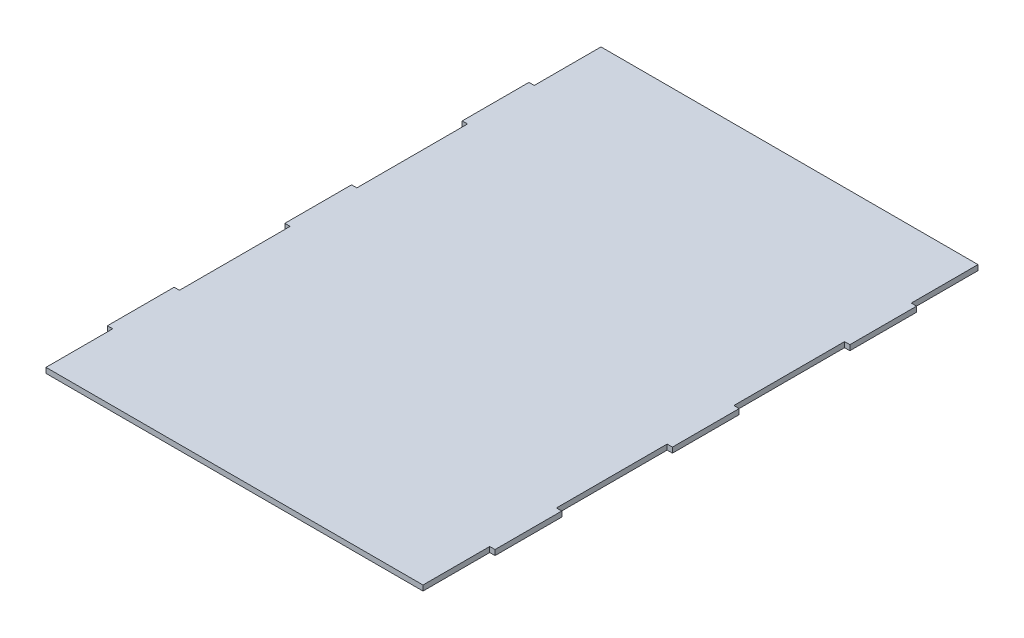
ISO-10303-21;
HEADER;
FILE_DESCRIPTION(('STEP AP214'),'2;1');
FILE_NAME('part.step','',(''),(''),'','','');
FILE_SCHEMA(('AUTOMOTIVE_DESIGN { 1 0 10303 214 1 1 1 1 }'));
ENDSEC;
DATA;
#1=APPLICATION_CONTEXT('core data for automotive mechanical design processes');
#2=APPLICATION_PROTOCOL_DEFINITION('international standard','automotive_design',2000,#1);
#3=PRODUCT_CONTEXT('',#1,'mechanical');
#4=PRODUCT('Part','Part','',(#3));
#5=PRODUCT_RELATED_PRODUCT_CATEGORY('part','',(#4));
#6=PRODUCT_DEFINITION_FORMATION('','',#4);
#7=PRODUCT_DEFINITION_CONTEXT('part definition',#1,'design');
#8=PRODUCT_DEFINITION('design','',#6,#7);
#9=PRODUCT_DEFINITION_SHAPE('','',#8);
#10=(LENGTH_UNIT() NAMED_UNIT(*) SI_UNIT(.MILLI.,.METRE.));
#11=(NAMED_UNIT(*) PLANE_ANGLE_UNIT() SI_UNIT($,.RADIAN.));
#12=(NAMED_UNIT(*) SI_UNIT($,.STERADIAN.) SOLID_ANGLE_UNIT());
#13=UNCERTAINTY_MEASURE_WITH_UNIT(LENGTH_MEASURE(1.E-05),#10,'distance_accuracy_value','');
#14=(GEOMETRIC_REPRESENTATION_CONTEXT(3) GLOBAL_UNCERTAINTY_ASSIGNED_CONTEXT((#13)) GLOBAL_UNIT_ASSIGNED_CONTEXT((#10,
#11,#12)) REPRESENTATION_CONTEXT('',''));
#15=CARTESIAN_POINT('',(0.,0.,0.));
#16=DIRECTION('',(0.,0.,1.));
#17=DIRECTION('',(1.,0.,0.));
#18=AXIS2_PLACEMENT_3D('',#15,#16,#17);
#19=CARTESIAN_POINT('',(226.,3.175,0.));
#20=DIRECTION('',(-1.,0.,0.));
#21=DIRECTION('',(0.,0.,1.));
#22=AXIS2_PLACEMENT_3D('',#19,#20,#21);
#23=PLANE('',#22);
#24=DIRECTION('',(0.,0.,-1.));
#25=VECTOR('',#24,1.);
#26=CARTESIAN_POINT('',(226.,3.175,0.));
#27=LINE('',#26,#25);
#28=CARTESIAN_POINT('',(226.,3.175,252.7));
#29=VERTEX_POINT('',#28);
#30=CARTESIAN_POINT('',(226.,3.175,186.35));
#31=VERTEX_POINT('',#30);
#32=EDGE_CURVE('E37',#29,#31,#27,.T.);
#33=ORIENTED_EDGE('',*,*,#32,.F.);
#34=DIRECTION('',(0.,1.,0.));
#35=VECTOR('',#34,1.);
#36=CARTESIAN_POINT('',(226.,-40.1258099606725,252.7));
#37=LINE('',#36,#35);
#38=CARTESIAN_POINT('',(226.,0.,252.7));
#39=VERTEX_POINT('',#38);
#40=EDGE_CURVE('E252',#39,#29,#37,.T.);
#41=ORIENTED_EDGE('',*,*,#40,.F.);
#42=DIRECTION('',(0.,0.,-1.));
#43=VECTOR('',#42,1.);
#44=CARTESIAN_POINT('',(226.,0.,0.));
#45=LINE('',#44,#43);
#46=CARTESIAN_POINT('',(226.,0.,186.35));
#47=VERTEX_POINT('',#46);
#48=EDGE_CURVE('E431',#39,#47,#45,.T.);
#49=ORIENTED_EDGE('',*,*,#48,.T.);
#50=DIRECTION('',(0.,1.,0.));
#51=VECTOR('',#50,1.);
#52=CARTESIAN_POINT('',(226.,-40.1258099606725,186.35));
#53=LINE('',#52,#51);
#54=EDGE_CURVE('E298',#47,#31,#53,.T.);
#55=ORIENTED_EDGE('',*,*,#54,.T.);
#56=EDGE_LOOP('',(#33,#41,#49,#55));
#57=FACE_BOUND('',#56,.T.);
#58=ADVANCED_FACE('F33',(#57),#23,.F.);
#59=CARTESIAN_POINT('',(0.,3.175,0.));
#60=DIRECTION('',(1.,0.,0.));
#61=DIRECTION('',(0.,0.,-1.));
#62=AXIS2_PLACEMENT_3D('',#59,#60,#61);
#63=PLANE('',#62);
#64=DIRECTION('',(0.,0.,1.));
#65=VECTOR('',#64,1.);
#66=CARTESIAN_POINT('',(0.,3.175,0.));
#67=LINE('',#66,#65);
#68=CARTESIAN_POINT('',(0.,3.175,292.7));
#69=VERTEX_POINT('',#68);
#70=CARTESIAN_POINT('',(0.,3.175,332.7));
#71=VERTEX_POINT('',#70);
#72=EDGE_CURVE('E425',#69,#71,#67,.T.);
#73=ORIENTED_EDGE('',*,*,#72,.F.);
#74=DIRECTION('',(0.,1.,0.));
#75=VECTOR('',#74,1.);
#76=CARTESIAN_POINT('',(0.,-40.1258099606725,292.7));
#77=LINE('',#76,#75);
#78=CARTESIAN_POINT('',(0.,0.,292.7));
#79=VERTEX_POINT('',#78);
#80=EDGE_CURVE('E262',#79,#69,#77,.T.);
#81=ORIENTED_EDGE('',*,*,#80,.F.);
#82=DIRECTION('',(0.,0.,1.));
#83=VECTOR('',#82,1.);
#84=CARTESIAN_POINT('',(0.,0.,0.));
#85=LINE('',#84,#83);
#86=CARTESIAN_POINT('',(0.,0.,332.7));
#87=VERTEX_POINT('',#86);
#88=EDGE_CURVE('E403',#79,#87,#85,.T.);
#89=ORIENTED_EDGE('',*,*,#88,.T.);
#90=DIRECTION('',(0.,-1.,0.));
#91=VECTOR('',#90,1.);
#92=CARTESIAN_POINT('',(0.,3.175,332.7));
#93=LINE('',#92,#91);
#94=EDGE_CURVE('E11',#71,#87,#93,.T.);
#95=ORIENTED_EDGE('',*,*,#94,.F.);
#96=EDGE_LOOP('',(#73,#81,#89,#95));
#97=FACE_BOUND('',#96,.T.);
#98=ADVANCED_FACE('F518',(#97),#63,.F.);
#99=CARTESIAN_POINT('',(226.,3.175,146.35));
#100=VERTEX_POINT('',#99);
#101=CARTESIAN_POINT('',(226.,3.175,80.));
#102=VERTEX_POINT('',#101);
#103=EDGE_CURVE('E433',#100,#102,#27,.T.);
#104=ORIENTED_EDGE('',*,*,#103,.F.);
#105=DIRECTION('',(0.,1.,0.));
#106=VECTOR('',#105,1.);
#107=CARTESIAN_POINT('',(226.,-40.1258099606725,146.35));
#108=LINE('',#107,#106);
#109=CARTESIAN_POINT('',(226.,0.,146.35));
#110=VERTEX_POINT('',#109);
#111=EDGE_CURVE('E287',#110,#100,#108,.T.);
#112=ORIENTED_EDGE('',*,*,#111,.F.);
#113=CARTESIAN_POINT('',(226.,0.,80.));
#114=VERTEX_POINT('',#113);
#115=EDGE_CURVE('E428',#110,#114,#45,.T.);
#116=ORIENTED_EDGE('',*,*,#115,.T.);
#117=DIRECTION('',(0.,1.,0.));
#118=VECTOR('',#117,1.);
#119=CARTESIAN_POINT('',(226.,-40.1258099606725,80.));
#120=LINE('',#119,#118);
#121=EDGE_CURVE('E354',#114,#102,#120,.T.);
#122=ORIENTED_EDGE('',*,*,#121,.T.);
#123=EDGE_LOOP('',(#104,#112,#116,#122));
#124=FACE_BOUND('',#123,.T.);
#125=ADVANCED_FACE('F535',(#124),#23,.F.);
#126=CARTESIAN_POINT('',(0.,0.,186.35));
#127=VERTEX_POINT('',#126);
#128=CARTESIAN_POINT('',(0.,0.,252.7));
#129=VERTEX_POINT('',#128);
#130=EDGE_CURVE('E426',#127,#129,#85,.T.);
#131=ORIENTED_EDGE('',*,*,#130,.T.);
#132=DIRECTION('',(0.,1.,0.));
#133=VECTOR('',#132,1.);
#134=CARTESIAN_POINT('',(0.,-40.1258099606725,252.7));
#135=LINE('',#134,#133);
#136=CARTESIAN_POINT('',(0.,3.175,252.7));
#137=VERTEX_POINT('',#136);
#138=EDGE_CURVE('E273',#129,#137,#135,.T.);
#139=ORIENTED_EDGE('',*,*,#138,.T.);
#140=CARTESIAN_POINT('',(0.,3.175,186.35));
#141=VERTEX_POINT('',#140);
#142=EDGE_CURVE('E421',#141,#137,#67,.T.);
#143=ORIENTED_EDGE('',*,*,#142,.F.);
#144=DIRECTION('',(0.,1.,0.));
#145=VECTOR('',#144,1.);
#146=CARTESIAN_POINT('',(0.,-40.1258099606725,186.35));
#147=LINE('',#146,#145);
#148=EDGE_CURVE('E312',#127,#141,#147,.T.);
#149=ORIENTED_EDGE('',*,*,#148,.F.);
#150=EDGE_LOOP('',(#131,#139,#143,#149));
#151=FACE_BOUND('',#150,.T.);
#152=ADVANCED_FACE('F500',(#151),#63,.F.);
#153=DIRECTION('',(0.,1.,0.));
#154=VECTOR('',#153,1.);
#155=CARTESIAN_POINT('',(226.,-40.1258099606725,40.));
#156=LINE('',#155,#154);
#157=CARTESIAN_POINT('',(226.,0.,40.));
#158=VERTEX_POINT('',#157);
#159=CARTESIAN_POINT('',(226.,3.175,40.));
#160=VERTEX_POINT('',#159);
#161=EDGE_CURVE('E337',#158,#160,#156,.T.);
#162=ORIENTED_EDGE('',*,*,#161,.F.);
#163=CARTESIAN_POINT('',(226.,0.,0.));
#164=VERTEX_POINT('',#163);
#165=EDGE_CURVE('E432',#158,#164,#45,.T.);
#166=ORIENTED_EDGE('',*,*,#165,.T.);
#167=DIRECTION('',(0.,-1.,0.));
#168=VECTOR('',#167,1.);
#169=CARTESIAN_POINT('',(226.,3.175,0.));
#170=LINE('',#169,#168);
#171=CARTESIAN_POINT('',(226.,3.175,0.));
#172=VERTEX_POINT('',#171);
#173=EDGE_CURVE('E461',#172,#164,#170,.T.);
#174=ORIENTED_EDGE('',*,*,#173,.F.);
#175=EDGE_CURVE('E350',#160,#172,#27,.T.);
#176=ORIENTED_EDGE('',*,*,#175,.F.);
#177=EDGE_LOOP('',(#162,#166,#174,#176));
#178=FACE_BOUND('',#177,.T.);
#179=ADVANCED_FACE('F527',(#178),#23,.F.);
#180=CARTESIAN_POINT('',(0.,0.,80.));
#181=VERTEX_POINT('',#180);
#182=CARTESIAN_POINT('',(0.,0.,146.35));
#183=VERTEX_POINT('',#182);
#184=EDGE_CURVE('E455',#181,#183,#85,.T.);
#185=ORIENTED_EDGE('',*,*,#184,.T.);
#186=DIRECTION('',(0.,1.,0.));
#187=VECTOR('',#186,1.);
#188=CARTESIAN_POINT('',(0.,-40.1258099606725,146.35));
#189=LINE('',#188,#187);
#190=CARTESIAN_POINT('',(0.,3.175,146.35));
#191=VERTEX_POINT('',#190);
#192=EDGE_CURVE('E323',#183,#191,#189,.T.);
#193=ORIENTED_EDGE('',*,*,#192,.T.);
#194=CARTESIAN_POINT('',(0.,3.175,80.));
#195=VERTEX_POINT('',#194);
#196=EDGE_CURVE('E389',#195,#191,#67,.T.);
#197=ORIENTED_EDGE('',*,*,#196,.F.);
#198=DIRECTION('',(0.,1.,0.));
#199=VECTOR('',#198,1.);
#200=CARTESIAN_POINT('',(0.,-40.1258099606725,80.));
#201=LINE('',#200,#199);
#202=EDGE_CURVE('E376',#181,#195,#201,.T.);
#203=ORIENTED_EDGE('',*,*,#202,.F.);
#204=EDGE_LOOP('',(#185,#193,#197,#203));
#205=FACE_BOUND('',#204,.T.);
#206=ADVANCED_FACE('F537',(#205),#63,.F.);
#207=CARTESIAN_POINT('',(0.,0.,0.));
#208=VERTEX_POINT('',#207);
#209=CARTESIAN_POINT('',(0.,0.,40.));
#210=VERTEX_POINT('',#209);
#211=EDGE_CURVE('E458',#208,#210,#85,.T.);
#212=ORIENTED_EDGE('',*,*,#211,.T.);
#213=DIRECTION('',(0.,1.,0.));
#214=VECTOR('',#213,1.);
#215=CARTESIAN_POINT('',(0.,-40.1258099606725,40.));
#216=LINE('',#215,#214);
#217=CARTESIAN_POINT('',(0.,3.175,40.));
#218=VERTEX_POINT('',#217);
#219=EDGE_CURVE('E394',#210,#218,#216,.T.);
#220=ORIENTED_EDGE('',*,*,#219,.T.);
#221=CARTESIAN_POINT('',(0.,3.175,0.));
#222=VERTEX_POINT('',#221);
#223=EDGE_CURVE('E418',#222,#218,#67,.T.);
#224=ORIENTED_EDGE('',*,*,#223,.F.);
#225=DIRECTION('',(0.,-1.,0.));
#226=VECTOR('',#225,1.);
#227=CARTESIAN_POINT('',(0.,3.175,0.));
#228=LINE('',#227,#226);
#229=EDGE_CURVE('E463',#222,#208,#228,.T.);
#230=ORIENTED_EDGE('',*,*,#229,.T.);
#231=EDGE_LOOP('',(#212,#220,#224,#230));
#232=FACE_BOUND('',#231,.T.);
#233=ADVANCED_FACE('F35',(#232),#63,.F.);
#234=CARTESIAN_POINT('',(0.,3.175,332.7));
#235=DIRECTION('',(0.,0.,-1.));
#236=DIRECTION('',(-1.,0.,0.));
#237=AXIS2_PLACEMENT_3D('',#234,#235,#236);
#238=PLANE('',#237);
#239=DIRECTION('',(1.,0.,0.));
#240=VECTOR('',#239,1.);
#241=CARTESIAN_POINT('',(0.,0.,332.7));
#242=LINE('',#241,#240);
#243=CARTESIAN_POINT('',(226.,0.,332.7));
#244=VERTEX_POINT('',#243);
#245=EDGE_CURVE('E438',#87,#244,#242,.T.);
#246=ORIENTED_EDGE('',*,*,#245,.T.);
#247=DIRECTION('',(0.,-1.,0.));
#248=VECTOR('',#247,1.);
#249=CARTESIAN_POINT('',(226.,3.175,332.7));
#250=LINE('',#249,#248);
#251=CARTESIAN_POINT('',(226.,3.175,332.7));
#252=VERTEX_POINT('',#251);
#253=EDGE_CURVE('E43',#252,#244,#250,.T.);
#254=ORIENTED_EDGE('',*,*,#253,.F.);
#255=DIRECTION('',(1.,0.,0.));
#256=VECTOR('',#255,1.);
#257=CARTESIAN_POINT('',(0.,3.175,332.7));
#258=LINE('',#257,#256);
#259=EDGE_CURVE('E413',#71,#252,#258,.T.);
#260=ORIENTED_EDGE('',*,*,#259,.F.);
#261=ORIENTED_EDGE('',*,*,#94,.T.);
#262=EDGE_LOOP('',(#246,#254,#260,#261));
#263=FACE_BOUND('',#262,.T.);
#264=ADVANCED_FACE('F522',(#263),#238,.F.);
#265=CARTESIAN_POINT('',(226.,0.,292.7));
#266=VERTEX_POINT('',#265);
#267=EDGE_CURVE('E446',#244,#266,#45,.T.);
#268=ORIENTED_EDGE('',*,*,#267,.T.);
#269=DIRECTION('',(0.,1.,0.));
#270=VECTOR('',#269,1.);
#271=CARTESIAN_POINT('',(226.,-40.1258099606725,292.7));
#272=LINE('',#271,#270);
#273=CARTESIAN_POINT('',(226.,3.175,292.7));
#274=VERTEX_POINT('',#273);
#275=EDGE_CURVE('E58',#266,#274,#272,.T.);
#276=ORIENTED_EDGE('',*,*,#275,.T.);
#277=EDGE_CURVE('E245',#252,#274,#27,.T.);
#278=ORIENTED_EDGE('',*,*,#277,.F.);
#279=ORIENTED_EDGE('',*,*,#253,.T.);
#280=EDGE_LOOP('',(#268,#276,#278,#279));
#281=FACE_BOUND('',#280,.T.);
#282=ADVANCED_FACE('F523',(#281),#23,.F.);
#283=CARTESIAN_POINT('',(0.,3.175,0.));
#284=DIRECTION('',(0.,0.,1.));
#285=DIRECTION('',(1.,0.,0.));
#286=AXIS2_PLACEMENT_3D('',#283,#284,#285);
#287=PLANE('',#286);
#288=DIRECTION('',(-1.,0.,0.));
#289=VECTOR('',#288,1.);
#290=CARTESIAN_POINT('',(0.,0.,0.));
#291=LINE('',#290,#289);
#292=EDGE_CURVE('E439',#164,#208,#291,.T.);
#293=ORIENTED_EDGE('',*,*,#292,.T.);
#294=ORIENTED_EDGE('',*,*,#229,.F.);
#295=DIRECTION('',(-1.,0.,0.));
#296=VECTOR('',#295,1.);
#297=CARTESIAN_POINT('',(0.,3.175,0.));
#298=LINE('',#297,#296);
#299=EDGE_CURVE('E452',#172,#222,#298,.T.);
#300=ORIENTED_EDGE('',*,*,#299,.F.);
#301=ORIENTED_EDGE('',*,*,#173,.T.);
#302=EDGE_LOOP('',(#293,#294,#300,#301));
#303=FACE_BOUND('',#302,.T.);
#304=ADVANCED_FACE('F525',(#303),#287,.F.);
#305=CARTESIAN_POINT('',(0.,3.175,0.));
#306=DIRECTION('',(0.,1.,0.));
#307=DIRECTION('',(0.,0.,1.));
#308=AXIS2_PLACEMENT_3D('',#305,#306,#307);
#309=PLANE('',#308);
#310=ORIENTED_EDGE('',*,*,#223,.T.);
#311=DIRECTION('',(-1.,0.,0.));
#312=VECTOR('',#311,1.);
#313=CARTESIAN_POINT('',(0.,3.175,40.));
#314=LINE('',#313,#312);
#315=CARTESIAN_POINT('',(-3.175,3.175,40.));
#316=VERTEX_POINT('',#315);
#317=EDGE_CURVE('E363',#218,#316,#314,.T.);
#318=ORIENTED_EDGE('',*,*,#317,.T.);
#319=DIRECTION('',(0.,0.,1.));
#320=VECTOR('',#319,1.);
#321=CARTESIAN_POINT('',(-3.175,3.175,40.));
#322=LINE('',#321,#320);
#323=CARTESIAN_POINT('',(-3.17499999999999,3.175,80.));
#324=VERTEX_POINT('',#323);
#325=EDGE_CURVE('E377',#316,#324,#322,.T.);
#326=ORIENTED_EDGE('',*,*,#325,.T.);
#327=DIRECTION('',(1.,0.,0.));
#328=VECTOR('',#327,1.);
#329=CARTESIAN_POINT('',(0.,3.175,80.));
#330=LINE('',#329,#328);
#331=EDGE_CURVE('E380',#324,#195,#330,.T.);
#332=ORIENTED_EDGE('',*,*,#331,.T.);
#333=ORIENTED_EDGE('',*,*,#196,.T.);
#334=DIRECTION('',(-1.,0.,0.));
#335=VECTOR('',#334,1.);
#336=CARTESIAN_POINT('',(0.,3.175,146.35));
#337=LINE('',#336,#335);
#338=CARTESIAN_POINT('',(-3.17499999999998,3.175,146.35));
#339=VERTEX_POINT('',#338);
#340=EDGE_CURVE('E308',#191,#339,#337,.T.);
#341=ORIENTED_EDGE('',*,*,#340,.T.);
#342=DIRECTION('',(0.,0.,1.));
#343=VECTOR('',#342,1.);
#344=CARTESIAN_POINT('',(-3.17499999999998,3.175,146.35));
#345=LINE('',#344,#343);
#346=CARTESIAN_POINT('',(-3.17499999999998,3.175,186.35));
#347=VERTEX_POINT('',#346);
#348=EDGE_CURVE('E317',#339,#347,#345,.T.);
#349=ORIENTED_EDGE('',*,*,#348,.T.);
#350=DIRECTION('',(1.,0.,0.));
#351=VECTOR('',#350,1.);
#352=CARTESIAN_POINT('',(0.,3.175,186.35));
#353=LINE('',#352,#351);
#354=EDGE_CURVE('E320',#347,#141,#353,.T.);
#355=ORIENTED_EDGE('',*,*,#354,.T.);
#356=ORIENTED_EDGE('',*,*,#142,.T.);
#357=DIRECTION('',(-1.,0.,0.));
#358=VECTOR('',#357,1.);
#359=CARTESIAN_POINT('',(0.,3.175,252.7));
#360=LINE('',#359,#358);
#361=CARTESIAN_POINT('',(-3.17499999999997,3.175,252.7));
#362=VERTEX_POINT('',#361);
#363=EDGE_CURVE('E258',#137,#362,#360,.T.);
#364=ORIENTED_EDGE('',*,*,#363,.T.);
#365=DIRECTION('',(0.,0.,1.));
#366=VECTOR('',#365,1.);
#367=CARTESIAN_POINT('',(-3.17499999999997,3.175,252.7));
#368=LINE('',#367,#366);
#369=CARTESIAN_POINT('',(-3.17499999999996,3.175,292.7));
#370=VERTEX_POINT('',#369);
#371=EDGE_CURVE('E267',#362,#370,#368,.T.);
#372=ORIENTED_EDGE('',*,*,#371,.T.);
#373=DIRECTION('',(1.,0.,0.));
#374=VECTOR('',#373,1.);
#375=CARTESIAN_POINT('',(0.,3.175,292.7));
#376=LINE('',#375,#374);
#377=EDGE_CURVE('E270',#370,#69,#376,.T.);
#378=ORIENTED_EDGE('',*,*,#377,.T.);
#379=ORIENTED_EDGE('',*,*,#72,.T.);
#380=ORIENTED_EDGE('',*,*,#259,.T.);
#381=ORIENTED_EDGE('',*,*,#277,.T.);
#382=DIRECTION('',(1.,0.,0.));
#383=VECTOR('',#382,1.);
#384=CARTESIAN_POINT('',(226.,3.175,292.7));
#385=LINE('',#384,#383);
#386=CARTESIAN_POINT('',(229.175,3.175,292.7));
#387=VERTEX_POINT('',#386);
#388=EDGE_CURVE('E227',#274,#387,#385,.T.);
#389=ORIENTED_EDGE('',*,*,#388,.T.);
#390=DIRECTION('',(0.,0.,-1.));
#391=VECTOR('',#390,1.);
#392=CARTESIAN_POINT('',(229.175,3.175,252.7));
#393=LINE('',#392,#391);
#394=CARTESIAN_POINT('',(229.175,3.175,252.7));
#395=VERTEX_POINT('',#394);
#396=EDGE_CURVE('E235',#387,#395,#393,.T.);
#397=ORIENTED_EDGE('',*,*,#396,.T.);
#398=DIRECTION('',(-1.,0.,0.));
#399=VECTOR('',#398,1.);
#400=CARTESIAN_POINT('',(226.,3.175,252.7));
#401=LINE('',#400,#399);
#402=EDGE_CURVE('E241',#395,#29,#401,.T.);
#403=ORIENTED_EDGE('',*,*,#402,.T.);
#404=ORIENTED_EDGE('',*,*,#32,.T.);
#405=DIRECTION('',(1.,0.,0.));
#406=VECTOR('',#405,1.);
#407=CARTESIAN_POINT('',(226.,3.175,186.35));
#408=LINE('',#407,#406);
#409=CARTESIAN_POINT('',(229.175,3.175,186.35));
#410=VERTEX_POINT('',#409);
#411=EDGE_CURVE('E283',#31,#410,#408,.T.);
#412=ORIENTED_EDGE('',*,*,#411,.T.);
#413=DIRECTION('',(0.,0.,-1.));
#414=VECTOR('',#413,1.);
#415=CARTESIAN_POINT('',(229.175,3.175,146.35));
#416=LINE('',#415,#414);
#417=CARTESIAN_POINT('',(229.175,3.175,146.35));
#418=VERTEX_POINT('',#417);
#419=EDGE_CURVE('E292',#410,#418,#416,.T.);
#420=ORIENTED_EDGE('',*,*,#419,.T.);
#421=DIRECTION('',(-1.,0.,0.));
#422=VECTOR('',#421,1.);
#423=CARTESIAN_POINT('',(226.,3.175,146.35));
#424=LINE('',#423,#422);
#425=EDGE_CURVE('E295',#418,#100,#424,.T.);
#426=ORIENTED_EDGE('',*,*,#425,.T.);
#427=ORIENTED_EDGE('',*,*,#103,.T.);
#428=DIRECTION('',(1.,0.,0.));
#429=VECTOR('',#428,1.);
#430=CARTESIAN_POINT('',(226.,3.175,80.));
#431=LINE('',#430,#429);
#432=CARTESIAN_POINT('',(229.175,3.175,80.));
#433=VERTEX_POINT('',#432);
#434=EDGE_CURVE('E333',#102,#433,#431,.T.);
#435=ORIENTED_EDGE('',*,*,#434,.T.);
#436=DIRECTION('',(0.,0.,-1.));
#437=VECTOR('',#436,1.);
#438=CARTESIAN_POINT('',(229.175,3.175,40.));
#439=LINE('',#438,#437);
#440=CARTESIAN_POINT('',(229.175,3.175,40.));
#441=VERTEX_POINT('',#440);
#442=EDGE_CURVE('E338',#433,#441,#439,.T.);
#443=ORIENTED_EDGE('',*,*,#442,.T.);
#444=DIRECTION('',(-1.,0.,0.));
#445=VECTOR('',#444,1.);
#446=CARTESIAN_POINT('',(226.,3.175,40.));
#447=LINE('',#446,#445);
#448=EDGE_CURVE('E341',#441,#160,#447,.T.);
#449=ORIENTED_EDGE('',*,*,#448,.T.);
#450=ORIENTED_EDGE('',*,*,#175,.T.);
#451=ORIENTED_EDGE('',*,*,#299,.T.);
#452=EDGE_LOOP('',(#310,#318,#326,#332,#333,#341,#349,#355,#356,#364,#372,#378,#379,#380,#381,
#389,#397,#403,#404,#412,#420,#426,#427,#435,#443,#449,#450,#451));
#453=FACE_BOUND('',#452,.T.);
#454=ADVANCED_FACE('F244',(#453),#309,.T.);
#455=CARTESIAN_POINT('',(0.,0.,0.));
#456=DIRECTION('',(0.,1.,0.));
#457=DIRECTION('',(0.,0.,1.));
#458=AXIS2_PLACEMENT_3D('',#455,#456,#457);
#459=PLANE('',#458);
#460=ORIENTED_EDGE('',*,*,#211,.F.);
#461=ORIENTED_EDGE('',*,*,#292,.F.);
#462=ORIENTED_EDGE('',*,*,#165,.F.);
#463=DIRECTION('',(1.,0.,0.));
#464=VECTOR('',#463,1.);
#465=CARTESIAN_POINT('',(226.,0.,40.));
#466=LINE('',#465,#464);
#467=CARTESIAN_POINT('',(229.175,0.,40.));
#468=VERTEX_POINT('',#467);
#469=EDGE_CURVE('E336',#158,#468,#466,.T.);
#470=ORIENTED_EDGE('',*,*,#469,.T.);
#471=DIRECTION('',(0.,0.,1.));
#472=VECTOR('',#471,1.);
#473=CARTESIAN_POINT('',(229.175,0.,40.));
#474=LINE('',#473,#472);
#475=CARTESIAN_POINT('',(229.175,0.,80.));
#476=VERTEX_POINT('',#475);
#477=EDGE_CURVE('E334',#468,#476,#474,.T.);
#478=ORIENTED_EDGE('',*,*,#477,.T.);
#479=DIRECTION('',(-1.,0.,0.));
#480=VECTOR('',#479,1.);
#481=CARTESIAN_POINT('',(226.,0.,80.));
#482=LINE('',#481,#480);
#483=EDGE_CURVE('E358',#476,#114,#482,.T.);
#484=ORIENTED_EDGE('',*,*,#483,.T.);
#485=ORIENTED_EDGE('',*,*,#115,.F.);
#486=DIRECTION('',(1.,0.,0.));
#487=VECTOR('',#486,1.);
#488=CARTESIAN_POINT('',(226.,0.,146.35));
#489=LINE('',#488,#487);
#490=CARTESIAN_POINT('',(229.175,0.,146.35));
#491=VERTEX_POINT('',#490);
#492=EDGE_CURVE('E286',#110,#491,#489,.T.);
#493=ORIENTED_EDGE('',*,*,#492,.T.);
#494=DIRECTION('',(0.,0.,1.));
#495=VECTOR('',#494,1.);
#496=CARTESIAN_POINT('',(229.175,0.,146.35));
#497=LINE('',#496,#495);
#498=CARTESIAN_POINT('',(229.175,0.,186.35));
#499=VERTEX_POINT('',#498);
#500=EDGE_CURVE('E284',#491,#499,#497,.T.);
#501=ORIENTED_EDGE('',*,*,#500,.T.);
#502=DIRECTION('',(-1.,0.,0.));
#503=VECTOR('',#502,1.);
#504=CARTESIAN_POINT('',(226.,0.,186.35));
#505=LINE('',#504,#503);
#506=EDGE_CURVE('E289',#499,#47,#505,.T.);
#507=ORIENTED_EDGE('',*,*,#506,.T.);
#508=ORIENTED_EDGE('',*,*,#48,.F.);
#509=DIRECTION('',(1.,0.,0.));
#510=VECTOR('',#509,1.);
#511=CARTESIAN_POINT('',(226.,0.,252.7));
#512=LINE('',#511,#510);
#513=CARTESIAN_POINT('',(229.175,0.,252.7));
#514=VERTEX_POINT('',#513);
#515=EDGE_CURVE('E248',#39,#514,#512,.T.);
#516=ORIENTED_EDGE('',*,*,#515,.T.);
#517=DIRECTION('',(0.,0.,1.));
#518=VECTOR('',#517,1.);
#519=CARTESIAN_POINT('',(229.175,0.,252.7));
#520=LINE('',#519,#518);
#521=CARTESIAN_POINT('',(229.175,0.,292.7));
#522=VERTEX_POINT('',#521);
#523=EDGE_CURVE('E254',#514,#522,#520,.T.);
#524=ORIENTED_EDGE('',*,*,#523,.T.);
#525=DIRECTION('',(-1.,0.,0.));
#526=VECTOR('',#525,1.);
#527=CARTESIAN_POINT('',(226.,0.,292.7));
#528=LINE('',#527,#526);
#529=EDGE_CURVE('E229',#522,#266,#528,.T.);
#530=ORIENTED_EDGE('',*,*,#529,.T.);
#531=ORIENTED_EDGE('',*,*,#267,.F.);
#532=ORIENTED_EDGE('',*,*,#245,.F.);
#533=ORIENTED_EDGE('',*,*,#88,.F.);
#534=DIRECTION('',(-1.,0.,0.));
#535=VECTOR('',#534,1.);
#536=CARTESIAN_POINT('',(0.,0.,292.7));
#537=LINE('',#536,#535);
#538=CARTESIAN_POINT('',(-3.17499999999996,0.,292.7));
#539=VERTEX_POINT('',#538);
#540=EDGE_CURVE('E261',#79,#539,#537,.T.);
#541=ORIENTED_EDGE('',*,*,#540,.T.);
#542=DIRECTION('',(0.,0.,-1.));
#543=VECTOR('',#542,1.);
#544=CARTESIAN_POINT('',(-3.17499999999997,0.,252.7));
#545=LINE('',#544,#543);
#546=CARTESIAN_POINT('',(-3.17499999999997,0.,252.7));
#547=VERTEX_POINT('',#546);
#548=EDGE_CURVE('E259',#539,#547,#545,.T.);
#549=ORIENTED_EDGE('',*,*,#548,.T.);
#550=DIRECTION('',(1.,0.,0.));
#551=VECTOR('',#550,1.);
#552=CARTESIAN_POINT('',(0.,0.,252.7));
#553=LINE('',#552,#551);
#554=EDGE_CURVE('E264',#547,#129,#553,.T.);
#555=ORIENTED_EDGE('',*,*,#554,.T.);
#556=ORIENTED_EDGE('',*,*,#130,.F.);
#557=DIRECTION('',(-1.,0.,0.));
#558=VECTOR('',#557,1.);
#559=CARTESIAN_POINT('',(0.,0.,186.35));
#560=LINE('',#559,#558);
#561=CARTESIAN_POINT('',(-3.17499999999998,0.,186.35));
#562=VERTEX_POINT('',#561);
#563=EDGE_CURVE('E311',#127,#562,#560,.T.);
#564=ORIENTED_EDGE('',*,*,#563,.T.);
#565=DIRECTION('',(0.,0.,-1.));
#566=VECTOR('',#565,1.);
#567=CARTESIAN_POINT('',(-3.17499999999998,0.,146.35));
#568=LINE('',#567,#566);
#569=CARTESIAN_POINT('',(-3.17499999999998,0.,146.35));
#570=VERTEX_POINT('',#569);
#571=EDGE_CURVE('E309',#562,#570,#568,.T.);
#572=ORIENTED_EDGE('',*,*,#571,.T.);
#573=DIRECTION('',(1.,0.,0.));
#574=VECTOR('',#573,1.);
#575=CARTESIAN_POINT('',(0.,0.,146.35));
#576=LINE('',#575,#574);
#577=EDGE_CURVE('E314',#570,#183,#576,.T.);
#578=ORIENTED_EDGE('',*,*,#577,.T.);
#579=ORIENTED_EDGE('',*,*,#184,.F.);
#580=DIRECTION('',(-1.,0.,0.));
#581=VECTOR('',#580,1.);
#582=CARTESIAN_POINT('',(0.,0.,80.));
#583=LINE('',#582,#581);
#584=CARTESIAN_POINT('',(-3.17499999999999,0.,80.));
#585=VERTEX_POINT('',#584);
#586=EDGE_CURVE('E375',#181,#585,#583,.T.);
#587=ORIENTED_EDGE('',*,*,#586,.T.);
#588=DIRECTION('',(0.,0.,-1.));
#589=VECTOR('',#588,1.);
#590=CARTESIAN_POINT('',(-3.175,0.,40.));
#591=LINE('',#590,#589);
#592=CARTESIAN_POINT('',(-3.175,0.,40.));
#593=VERTEX_POINT('',#592);
#594=EDGE_CURVE('E373',#585,#593,#591,.T.);
#595=ORIENTED_EDGE('',*,*,#594,.T.);
#596=DIRECTION('',(1.,0.,0.));
#597=VECTOR('',#596,1.);
#598=CARTESIAN_POINT('',(0.,0.,40.));
#599=LINE('',#598,#597);
#600=EDGE_CURVE('E398',#593,#210,#599,.T.);
#601=ORIENTED_EDGE('',*,*,#600,.T.);
#602=EDGE_LOOP('',(#460,#461,#462,#470,#478,#484,#485,#493,#501,#507,#508,#516,#524,#530,#531,
#532,#533,#541,#549,#555,#556,#564,#572,#578,#579,#587,#595,#601));
#603=FACE_BOUND('',#602,.T.);
#604=ADVANCED_FACE('F564',(#603),#459,.F.);
#605=CARTESIAN_POINT('',(0.,-40.1258099606725,80.));
#606=DIRECTION('',(0.,0.,1.));
#607=DIRECTION('',(1.,0.,0.));
#608=AXIS2_PLACEMENT_3D('',#605,#606,#607);
#609=PLANE('',#608);
#610=ORIENTED_EDGE('',*,*,#586,.F.);
#611=ORIENTED_EDGE('',*,*,#202,.T.);
#612=ORIENTED_EDGE('',*,*,#331,.F.);
#613=DIRECTION('',(0.,1.,0.));
#614=VECTOR('',#613,1.);
#615=CARTESIAN_POINT('',(-3.17499999999999,-40.1258099606725,80.));
#616=LINE('',#615,#614);
#617=EDGE_CURVE('E383',#585,#324,#616,.T.);
#618=ORIENTED_EDGE('',*,*,#617,.F.);
#619=EDGE_LOOP('',(#610,#611,#612,#618));
#620=FACE_BOUND('',#619,.T.);
#621=ADVANCED_FACE('F590',(#620),#609,.T.);
#622=CARTESIAN_POINT('',(-3.175,-40.1258099606725,40.));
#623=DIRECTION('',(-1.,0.,0.));
#624=DIRECTION('',(0.,0.,1.));
#625=AXIS2_PLACEMENT_3D('',#622,#623,#624);
#626=PLANE('',#625);
#627=ORIENTED_EDGE('',*,*,#594,.F.);
#628=ORIENTED_EDGE('',*,*,#617,.T.);
#629=ORIENTED_EDGE('',*,*,#325,.F.);
#630=DIRECTION('',(0.,1.,0.));
#631=VECTOR('',#630,1.);
#632=CARTESIAN_POINT('',(-3.175,-40.1258099606725,40.));
#633=LINE('',#632,#631);
#634=EDGE_CURVE('E408',#593,#316,#633,.T.);
#635=ORIENTED_EDGE('',*,*,#634,.F.);
#636=EDGE_LOOP('',(#627,#628,#629,#635));
#637=FACE_BOUND('',#636,.T.);
#638=ADVANCED_FACE('F634',(#637),#626,.T.);
#639=CARTESIAN_POINT('',(0.,-40.1258099606725,40.));
#640=DIRECTION('',(0.,0.,-1.));
#641=DIRECTION('',(-1.,0.,0.));
#642=AXIS2_PLACEMENT_3D('',#639,#640,#641);
#643=PLANE('',#642);
#644=ORIENTED_EDGE('',*,*,#600,.F.);
#645=ORIENTED_EDGE('',*,*,#634,.T.);
#646=ORIENTED_EDGE('',*,*,#317,.F.);
#647=ORIENTED_EDGE('',*,*,#219,.F.);
#648=EDGE_LOOP('',(#644,#645,#646,#647));
#649=FACE_BOUND('',#648,.T.);
#650=ADVANCED_FACE('F583',(#649),#643,.T.);
#651=CARTESIAN_POINT('',(226.,-40.1258099606725,40.));
#652=DIRECTION('',(0.,0.,-1.));
#653=DIRECTION('',(-1.,0.,0.));
#654=AXIS2_PLACEMENT_3D('',#651,#652,#653);
#655=PLANE('',#654);
#656=ORIENTED_EDGE('',*,*,#469,.F.);
#657=ORIENTED_EDGE('',*,*,#161,.T.);
#658=ORIENTED_EDGE('',*,*,#448,.F.);
#659=DIRECTION('',(0.,1.,0.));
#660=VECTOR('',#659,1.);
#661=CARTESIAN_POINT('',(229.175,-40.1258099606725,40.));
#662=LINE('',#661,#660);
#663=EDGE_CURVE('E344',#468,#441,#662,.T.);
#664=ORIENTED_EDGE('',*,*,#663,.F.);
#665=EDGE_LOOP('',(#656,#657,#658,#664));
#666=FACE_BOUND('',#665,.T.);
#667=ADVANCED_FACE('F577',(#666),#655,.T.);
#668=CARTESIAN_POINT('',(229.175,-40.1258099606725,40.));
#669=DIRECTION('',(1.,0.,0.));
#670=DIRECTION('',(0.,0.,-1.));
#671=AXIS2_PLACEMENT_3D('',#668,#669,#670);
#672=PLANE('',#671);
#673=ORIENTED_EDGE('',*,*,#477,.F.);
#674=ORIENTED_EDGE('',*,*,#663,.T.);
#675=ORIENTED_EDGE('',*,*,#442,.F.);
#676=DIRECTION('',(0.,1.,0.));
#677=VECTOR('',#676,1.);
#678=CARTESIAN_POINT('',(229.175,-40.1258099606725,80.));
#679=LINE('',#678,#677);
#680=EDGE_CURVE('E369',#476,#433,#679,.T.);
#681=ORIENTED_EDGE('',*,*,#680,.F.);
#682=EDGE_LOOP('',(#673,#674,#675,#681));
#683=FACE_BOUND('',#682,.T.);
#684=ADVANCED_FACE('F627',(#683),#672,.T.);
#685=CARTESIAN_POINT('',(226.,-40.1258099606725,80.));
#686=DIRECTION('',(0.,0.,1.));
#687=DIRECTION('',(1.,0.,0.));
#688=AXIS2_PLACEMENT_3D('',#685,#686,#687);
#689=PLANE('',#688);
#690=ORIENTED_EDGE('',*,*,#483,.F.);
#691=ORIENTED_EDGE('',*,*,#680,.T.);
#692=ORIENTED_EDGE('',*,*,#434,.F.);
#693=ORIENTED_EDGE('',*,*,#121,.F.);
#694=EDGE_LOOP('',(#690,#691,#692,#693));
#695=FACE_BOUND('',#694,.T.);
#696=ADVANCED_FACE('F570',(#695),#689,.T.);
#697=CARTESIAN_POINT('',(0.,-40.1258099606725,186.35));
#698=DIRECTION('',(0.,0.,1.));
#699=DIRECTION('',(1.,0.,0.));
#700=AXIS2_PLACEMENT_3D('',#697,#698,#699);
#701=PLANE('',#700);
#702=ORIENTED_EDGE('',*,*,#563,.F.);
#703=ORIENTED_EDGE('',*,*,#148,.T.);
#704=ORIENTED_EDGE('',*,*,#354,.F.);
#705=DIRECTION('',(0.,1.,0.));
#706=VECTOR('',#705,1.);
#707=CARTESIAN_POINT('',(-3.17499999999998,-40.1258099606725,186.35));
#708=LINE('',#707,#706);
#709=EDGE_CURVE('E326',#562,#347,#708,.T.);
#710=ORIENTED_EDGE('',*,*,#709,.F.);
#711=EDGE_LOOP('',(#702,#703,#704,#710));
#712=FACE_BOUND('',#711,.T.);
#713=ADVANCED_FACE('F497',(#712),#701,.T.);
#714=CARTESIAN_POINT('',(-3.17499999999998,-40.1258099606725,146.35));
#715=DIRECTION('',(-1.,0.,0.));
#716=DIRECTION('',(0.,0.,1.));
#717=AXIS2_PLACEMENT_3D('',#714,#715,#716);
#718=PLANE('',#717);
#719=ORIENTED_EDGE('',*,*,#571,.F.);
#720=ORIENTED_EDGE('',*,*,#709,.T.);
#721=ORIENTED_EDGE('',*,*,#348,.F.);
#722=DIRECTION('',(0.,1.,0.));
#723=VECTOR('',#722,1.);
#724=CARTESIAN_POINT('',(-3.17499999999998,-40.1258099606725,146.35));
#725=LINE('',#724,#723);
#726=EDGE_CURVE('E328',#570,#339,#725,.T.);
#727=ORIENTED_EDGE('',*,*,#726,.F.);
#728=EDGE_LOOP('',(#719,#720,#721,#727));
#729=FACE_BOUND('',#728,.T.);
#730=ADVANCED_FACE('F492',(#729),#718,.T.);
#731=CARTESIAN_POINT('',(0.,-40.1258099606725,146.35));
#732=DIRECTION('',(0.,0.,-1.));
#733=DIRECTION('',(-1.,0.,0.));
#734=AXIS2_PLACEMENT_3D('',#731,#732,#733);
#735=PLANE('',#734);
#736=ORIENTED_EDGE('',*,*,#577,.F.);
#737=ORIENTED_EDGE('',*,*,#726,.T.);
#738=ORIENTED_EDGE('',*,*,#340,.F.);
#739=ORIENTED_EDGE('',*,*,#192,.F.);
#740=EDGE_LOOP('',(#736,#737,#738,#739));
#741=FACE_BOUND('',#740,.T.);
#742=ADVANCED_FACE('F487',(#741),#735,.T.);
#743=CARTESIAN_POINT('',(226.,-40.1258099606725,146.35));
#744=DIRECTION('',(0.,0.,-1.));
#745=DIRECTION('',(-1.,0.,0.));
#746=AXIS2_PLACEMENT_3D('',#743,#744,#745);
#747=PLANE('',#746);
#748=ORIENTED_EDGE('',*,*,#492,.F.);
#749=ORIENTED_EDGE('',*,*,#111,.T.);
#750=ORIENTED_EDGE('',*,*,#425,.F.);
#751=DIRECTION('',(0.,1.,0.));
#752=VECTOR('',#751,1.);
#753=CARTESIAN_POINT('',(229.175,-40.1258099606725,146.35));
#754=LINE('',#753,#752);
#755=EDGE_CURVE('E301',#491,#418,#754,.T.);
#756=ORIENTED_EDGE('',*,*,#755,.F.);
#757=EDGE_LOOP('',(#748,#749,#750,#756));
#758=FACE_BOUND('',#757,.T.);
#759=ADVANCED_FACE('F554',(#758),#747,.T.);
#760=CARTESIAN_POINT('',(229.175,-40.1258099606725,146.35));
#761=DIRECTION('',(1.,0.,0.));
#762=DIRECTION('',(0.,0.,-1.));
#763=AXIS2_PLACEMENT_3D('',#760,#761,#762);
#764=PLANE('',#763);
#765=ORIENTED_EDGE('',*,*,#500,.F.);
#766=ORIENTED_EDGE('',*,*,#755,.T.);
#767=ORIENTED_EDGE('',*,*,#419,.F.);
#768=DIRECTION('',(0.,1.,0.));
#769=VECTOR('',#768,1.);
#770=CARTESIAN_POINT('',(229.175,-40.1258099606725,186.35));
#771=LINE('',#770,#769);
#772=EDGE_CURVE('E303',#499,#410,#771,.T.);
#773=ORIENTED_EDGE('',*,*,#772,.F.);
#774=EDGE_LOOP('',(#765,#766,#767,#773));
#775=FACE_BOUND('',#774,.T.);
#776=ADVANCED_FACE('F561',(#775),#764,.T.);
#777=CARTESIAN_POINT('',(226.,-40.1258099606725,186.35));
#778=DIRECTION('',(0.,0.,1.));
#779=DIRECTION('',(1.,0.,0.));
#780=AXIS2_PLACEMENT_3D('',#777,#778,#779);
#781=PLANE('',#780);
#782=ORIENTED_EDGE('',*,*,#506,.F.);
#783=ORIENTED_EDGE('',*,*,#772,.T.);
#784=ORIENTED_EDGE('',*,*,#411,.F.);
#785=ORIENTED_EDGE('',*,*,#54,.F.);
#786=EDGE_LOOP('',(#782,#783,#784,#785));
#787=FACE_BOUND('',#786,.T.);
#788=ADVANCED_FACE('F609',(#787),#781,.T.);
#789=CARTESIAN_POINT('',(0.,-40.1258099606725,292.7));
#790=DIRECTION('',(0.,0.,1.));
#791=DIRECTION('',(1.,0.,0.));
#792=AXIS2_PLACEMENT_3D('',#789,#790,#791);
#793=PLANE('',#792);
#794=ORIENTED_EDGE('',*,*,#540,.F.);
#795=ORIENTED_EDGE('',*,*,#80,.T.);
#796=ORIENTED_EDGE('',*,*,#377,.F.);
#797=DIRECTION('',(0.,1.,0.));
#798=VECTOR('',#797,1.);
#799=CARTESIAN_POINT('',(-3.17499999999996,-40.1258099606725,292.7));
#800=LINE('',#799,#798);
#801=EDGE_CURVE('E276',#539,#370,#800,.T.);
#802=ORIENTED_EDGE('',*,*,#801,.F.);
#803=EDGE_LOOP('',(#794,#795,#796,#802));
#804=FACE_BOUND('',#803,.T.);
#805=ADVANCED_FACE('F515',(#804),#793,.T.);
#806=CARTESIAN_POINT('',(-3.17499999999997,-40.1258099606725,252.7));
#807=DIRECTION('',(-1.,0.,0.));
#808=DIRECTION('',(0.,0.,1.));
#809=AXIS2_PLACEMENT_3D('',#806,#807,#808);
#810=PLANE('',#809);
#811=ORIENTED_EDGE('',*,*,#548,.F.);
#812=ORIENTED_EDGE('',*,*,#801,.T.);
#813=ORIENTED_EDGE('',*,*,#371,.F.);
#814=DIRECTION('',(0.,1.,0.));
#815=VECTOR('',#814,1.);
#816=CARTESIAN_POINT('',(-3.17499999999997,-40.1258099606725,252.7));
#817=LINE('',#816,#815);
#818=EDGE_CURVE('E278',#547,#362,#817,.T.);
#819=ORIENTED_EDGE('',*,*,#818,.F.);
#820=EDGE_LOOP('',(#811,#812,#813,#819));
#821=FACE_BOUND('',#820,.T.);
#822=ADVANCED_FACE('F510',(#821),#810,.T.);
#823=CARTESIAN_POINT('',(0.,-40.1258099606725,252.7));
#824=DIRECTION('',(0.,0.,-1.));
#825=DIRECTION('',(-1.,0.,0.));
#826=AXIS2_PLACEMENT_3D('',#823,#824,#825);
#827=PLANE('',#826);
#828=ORIENTED_EDGE('',*,*,#554,.F.);
#829=ORIENTED_EDGE('',*,*,#818,.T.);
#830=ORIENTED_EDGE('',*,*,#363,.F.);
#831=ORIENTED_EDGE('',*,*,#138,.F.);
#832=EDGE_LOOP('',(#828,#829,#830,#831));
#833=FACE_BOUND('',#832,.T.);
#834=ADVANCED_FACE('F505',(#833),#827,.T.);
#835=CARTESIAN_POINT('',(226.,-40.1258099606725,252.7));
#836=DIRECTION('',(0.,0.,-1.));
#837=DIRECTION('',(-1.,0.,0.));
#838=AXIS2_PLACEMENT_3D('',#835,#836,#837);
#839=PLANE('',#838);
#840=ORIENTED_EDGE('',*,*,#515,.F.);
#841=ORIENTED_EDGE('',*,*,#40,.T.);
#842=ORIENTED_EDGE('',*,*,#402,.F.);
#843=DIRECTION('',(0.,1.,0.));
#844=VECTOR('',#843,1.);
#845=CARTESIAN_POINT('',(229.175,-40.1258099606725,252.7));
#846=LINE('',#845,#844);
#847=EDGE_CURVE('E232',#514,#395,#846,.T.);
#848=ORIENTED_EDGE('',*,*,#847,.F.);
#849=EDGE_LOOP('',(#840,#841,#842,#848));
#850=FACE_BOUND('',#849,.T.);
#851=ADVANCED_FACE('F595',(#850),#839,.T.);
#852=CARTESIAN_POINT('',(229.175,-40.1258099606725,252.7));
#853=DIRECTION('',(1.,0.,0.));
#854=DIRECTION('',(0.,0.,-1.));
#855=AXIS2_PLACEMENT_3D('',#852,#853,#854);
#856=PLANE('',#855);
#857=ORIENTED_EDGE('',*,*,#523,.F.);
#858=ORIENTED_EDGE('',*,*,#847,.T.);
#859=ORIENTED_EDGE('',*,*,#396,.F.);
#860=DIRECTION('',(0.,1.,0.));
#861=VECTOR('',#860,1.);
#862=CARTESIAN_POINT('',(229.175,-40.1258099606725,292.7));
#863=LINE('',#862,#861);
#864=EDGE_CURVE('E223',#522,#387,#863,.T.);
#865=ORIENTED_EDGE('',*,*,#864,.F.);
#866=EDGE_LOOP('',(#857,#858,#859,#865));
#867=FACE_BOUND('',#866,.T.);
#868=ADVANCED_FACE('F236',(#867),#856,.T.);
#869=CARTESIAN_POINT('',(226.,-40.1258099606725,292.7));
#870=DIRECTION('',(0.,0.,1.));
#871=DIRECTION('',(1.,0.,0.));
#872=AXIS2_PLACEMENT_3D('',#869,#870,#871);
#873=PLANE('',#872);
#874=ORIENTED_EDGE('',*,*,#529,.F.);
#875=ORIENTED_EDGE('',*,*,#864,.T.);
#876=ORIENTED_EDGE('',*,*,#388,.F.);
#877=ORIENTED_EDGE('',*,*,#275,.F.);
#878=EDGE_LOOP('',(#874,#875,#876,#877));
#879=FACE_BOUND('',#878,.T.);
#880=ADVANCED_FACE('F225',(#879),#873,.T.);
#881=CLOSED_SHELL('',(#58,#98,#125,#152,#179,#206,#233,#264,#282,#304,#454,#604,#621,#638,#650,
#667,#684,#696,#713,#730,#742,#759,#776,#788,#805,#822,#834,#851,#868,#880));
#882=MANIFOLD_SOLID_BREP('B2',#881);
#883=ADVANCED_BREP_SHAPE_REPRESENTATION('',(#18,#882),#14);
#884=SHAPE_DEFINITION_REPRESENTATION(#9,#883);
ENDSEC;
END-ISO-10303-21;
